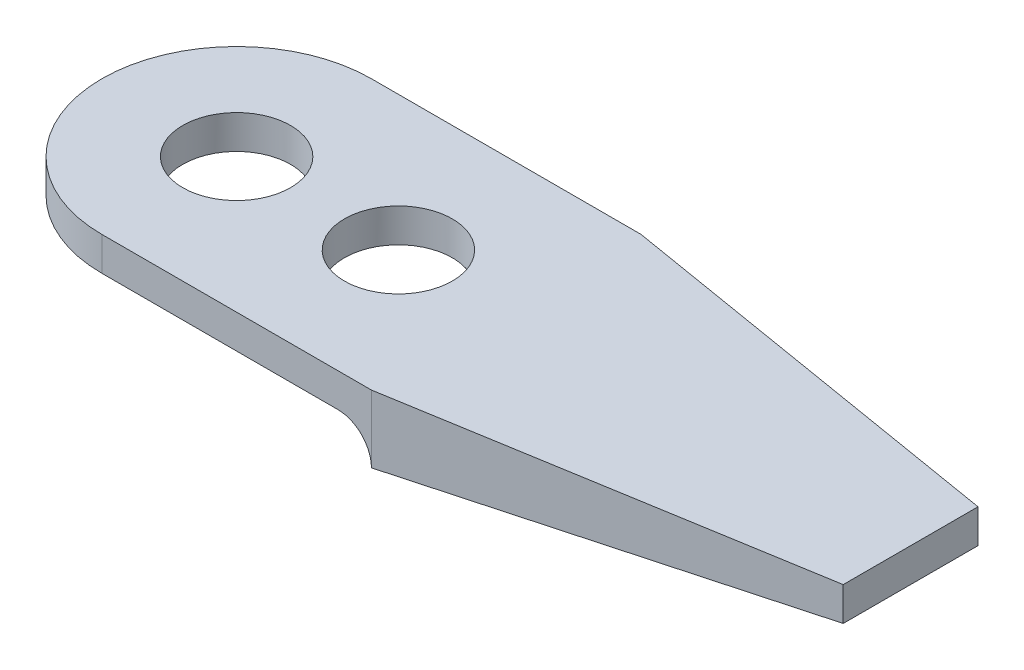
ISO-10303-21;
HEADER;
FILE_DESCRIPTION(('STEP AP214'),'2;1');
FILE_NAME('part.step','',(''),(''),'','','');
FILE_SCHEMA(('AUTOMOTIVE_DESIGN { 1 0 10303 214 1 1 1 1 }'));
ENDSEC;
DATA;
#1=APPLICATION_CONTEXT('core data for automotive mechanical design processes');
#2=APPLICATION_PROTOCOL_DEFINITION('international standard','automotive_design',2000,#1);
#3=PRODUCT_CONTEXT('',#1,'mechanical');
#4=PRODUCT('Part','Part','',(#3));
#5=PRODUCT_RELATED_PRODUCT_CATEGORY('part','',(#4));
#6=PRODUCT_DEFINITION_FORMATION('','',#4);
#7=PRODUCT_DEFINITION_CONTEXT('part definition',#1,'design');
#8=PRODUCT_DEFINITION('design','',#6,#7);
#9=PRODUCT_DEFINITION_SHAPE('','',#8);
#10=(LENGTH_UNIT() NAMED_UNIT(*) SI_UNIT(.MILLI.,.METRE.));
#11=(NAMED_UNIT(*) PLANE_ANGLE_UNIT() SI_UNIT($,.RADIAN.));
#12=(NAMED_UNIT(*) SI_UNIT($,.STERADIAN.) SOLID_ANGLE_UNIT());
#13=UNCERTAINTY_MEASURE_WITH_UNIT(LENGTH_MEASURE(1.E-05),#10,'distance_accuracy_value','');
#14=(GEOMETRIC_REPRESENTATION_CONTEXT(3) GLOBAL_UNCERTAINTY_ASSIGNED_CONTEXT((#13)) GLOBAL_UNIT_ASSIGNED_CONTEXT((#10,
#11,#12)) REPRESENTATION_CONTEXT('',''));
#15=CARTESIAN_POINT('',(0.,0.,0.));
#16=DIRECTION('',(0.,0.,1.));
#17=DIRECTION('',(1.,0.,0.));
#18=AXIS2_PLACEMENT_3D('',#15,#16,#17);
#19=CARTESIAN_POINT('',(19.05,-1.5875,6.35));
#20=DIRECTION('',(-0.0830454798537399,0.99654575824488,0.));
#21=DIRECTION('',(-0.99654575824488,-0.0830454798537399,0.));
#22=AXIS2_PLACEMENT_3D('',#19,#20,#21);
#23=PLANE('',#22);
#24=DIRECTION('',(0.983078304622849,0.081923192051904,-0.163846384103808));
#25=VECTOR('',#24,1.);
#26=CARTESIAN_POINT('',(18.5385906040268,-1.63011744966443,3.26023489932886));
#27=LINE('',#26,#25);
#28=CARTESIAN_POINT('',(0.,-3.175,6.35));
#29=VERTEX_POINT('',#28);
#30=CARTESIAN_POINT('',(19.05,-1.5875,3.175));
#31=VERTEX_POINT('',#30);
#32=EDGE_CURVE('E172',#29,#31,#27,.T.);
#33=ORIENTED_EDGE('',*,*,#32,.F.);
#34=DIRECTION('',(0.,0.,-1.));
#35=VECTOR('',#34,1.);
#36=CARTESIAN_POINT('',(0.,-3.175,6.35));
#37=LINE('',#36,#35);
#38=CARTESIAN_POINT('',(0.,-3.175,-6.35));
#39=VERTEX_POINT('',#38);
#40=EDGE_CURVE('E199',#29,#39,#37,.T.);
#41=ORIENTED_EDGE('',*,*,#40,.T.);
#42=DIRECTION('',(0.983078304622849,0.081923192051904,0.163846384103808));
#43=VECTOR('',#42,1.);
#44=CARTESIAN_POINT('',(20.5842281879195,-1.45964765100671,-2.91929530201342));
#45=LINE('',#44,#43);
#46=CARTESIAN_POINT('',(19.05,-1.5875,-3.175));
#47=VERTEX_POINT('',#46);
#48=EDGE_CURVE('E182',#39,#47,#45,.T.);
#49=ORIENTED_EDGE('',*,*,#48,.T.);
#50=DIRECTION('',(0.,0.,-1.));
#51=VECTOR('',#50,1.);
#52=CARTESIAN_POINT('',(19.05,-1.5875,6.35));
#53=LINE('',#52,#51);
#54=EDGE_CURVE('E196',#31,#47,#53,.T.);
#55=ORIENTED_EDGE('',*,*,#54,.F.);
#56=EDGE_LOOP('',(#33,#41,#49,#55));
#57=FACE_BOUND('',#56,.T.);
#58=ADVANCED_FACE('F39',(#57),#23,.F.);
#59=CARTESIAN_POINT('',(19.05,0.,6.35));
#60=DIRECTION('',(-1.,0.,0.));
#61=DIRECTION('',(0.,-1.,0.));
#62=AXIS2_PLACEMENT_3D('',#59,#60,#61);
#63=PLANE('',#62);
#64=DIRECTION('',(0.,1.,0.));
#65=VECTOR('',#64,1.);
#66=CARTESIAN_POINT('',(19.05,-12.7,3.175));
#67=LINE('',#66,#65);
#68=CARTESIAN_POINT('',(19.05,0.,3.175));
#69=VERTEX_POINT('',#68);
#70=EDGE_CURVE('E168',#31,#69,#67,.T.);
#71=ORIENTED_EDGE('',*,*,#70,.F.);
#72=ORIENTED_EDGE('',*,*,#54,.T.);
#73=DIRECTION('',(0.,1.,0.));
#74=VECTOR('',#73,1.);
#75=CARTESIAN_POINT('',(19.05,-12.7,-3.175));
#76=LINE('',#75,#74);
#77=CARTESIAN_POINT('',(19.05,0.,-3.175));
#78=VERTEX_POINT('',#77);
#79=EDGE_CURVE('E178',#47,#78,#76,.T.);
#80=ORIENTED_EDGE('',*,*,#79,.T.);
#81=DIRECTION('',(0.,0.,-1.));
#82=VECTOR('',#81,1.);
#83=CARTESIAN_POINT('',(19.05,0.,6.35));
#84=LINE('',#83,#82);
#85=EDGE_CURVE('E91',#69,#78,#84,.T.);
#86=ORIENTED_EDGE('',*,*,#85,.F.);
#87=EDGE_LOOP('',(#71,#72,#80,#86));
#88=FACE_BOUND('',#87,.T.);
#89=ADVANCED_FACE('F225',(#88),#63,.F.);
#90=CARTESIAN_POINT('',(-19.05,0.,6.35));
#91=DIRECTION('',(0.,-1.,0.));
#92=DIRECTION('',(0.,0.,-1.));
#93=AXIS2_PLACEMENT_3D('',#90,#91,#92);
#94=PLANE('',#93);
#95=CARTESIAN_POINT('',(-12.7,0.,0.));
#96=DIRECTION('',(0.,1.,0.));
#97=DIRECTION('',(0.,0.,1.));
#98=AXIS2_PLACEMENT_3D('',#95,#96,#97);
#99=CIRCLE('',#98,2.54);
#100=CARTESIAN_POINT('',(-12.7,0.,2.54));
#101=VERTEX_POINT('',#100);
#102=EDGE_CURVE('E151',#101,#101,#99,.T.);
#103=ORIENTED_EDGE('',*,*,#102,.F.);
#104=EDGE_LOOP('',(#103));
#105=FACE_BOUND('',#104,.T.);
#106=CARTESIAN_POINT('',(-5.08,0.,0.));
#107=DIRECTION('',(0.,1.,0.));
#108=DIRECTION('',(0.,0.,1.));
#109=AXIS2_PLACEMENT_3D('',#106,#107,#108);
#110=CIRCLE('',#109,2.54);
#111=CARTESIAN_POINT('',(-5.08,0.,2.54));
#112=VERTEX_POINT('',#111);
#113=EDGE_CURVE('E158',#112,#112,#110,.T.);
#114=ORIENTED_EDGE('',*,*,#113,.F.);
#115=EDGE_LOOP('',(#114));
#116=FACE_BOUND('',#115,.T.);
#117=DIRECTION('',(-1.,0.,0.));
#118=VECTOR('',#117,1.);
#119=CARTESIAN_POINT('',(-19.05,0.,-6.35));
#120=LINE('',#119,#118);
#121=CARTESIAN_POINT('',(0.,0.,-6.35));
#122=VERTEX_POINT('',#121);
#123=CARTESIAN_POINT('',(-12.7,0.,-6.35));
#124=VERTEX_POINT('',#123);
#125=EDGE_CURVE('E188',#122,#124,#120,.T.);
#126=ORIENTED_EDGE('',*,*,#125,.T.);
#127=CARTESIAN_POINT('',(-12.7,0.,0.));
#128=DIRECTION('',(0.,-1.,0.));
#129=DIRECTION('',(0.,0.,-1.));
#130=AXIS2_PLACEMENT_3D('',#127,#128,#129);
#131=CIRCLE('',#130,6.35);
#132=CARTESIAN_POINT('',(-19.05,0.,0.));
#133=VERTEX_POINT('',#132);
#134=EDGE_CURVE('E119',#124,#133,#131,.F.);
#135=ORIENTED_EDGE('',*,*,#134,.T.);
#136=CARTESIAN_POINT('',(-12.7,0.,0.));
#137=DIRECTION('',(0.,-1.,0.));
#138=DIRECTION('',(0.,0.,-1.));
#139=AXIS2_PLACEMENT_3D('',#136,#137,#138);
#140=CIRCLE('',#139,6.35);
#141=CARTESIAN_POINT('',(-12.7,0.,6.35));
#142=VERTEX_POINT('',#141);
#143=EDGE_CURVE('E113',#133,#142,#140,.F.);
#144=ORIENTED_EDGE('',*,*,#143,.T.);
#145=DIRECTION('',(-1.,0.,0.));
#146=VECTOR('',#145,1.);
#147=CARTESIAN_POINT('',(-19.05,0.,6.35));
#148=LINE('',#147,#146);
#149=CARTESIAN_POINT('',(0.,0.,6.35));
#150=VERTEX_POINT('',#149);
#151=EDGE_CURVE('E118',#150,#142,#148,.T.);
#152=ORIENTED_EDGE('',*,*,#151,.F.);
#153=DIRECTION('',(0.986393923832144,0.,-0.164398987305357));
#154=VECTOR('',#153,1.);
#155=CARTESIAN_POINT('',(0.,0.,6.35));
#156=LINE('',#155,#154);
#157=EDGE_CURVE('E145',#150,#69,#156,.T.);
#158=ORIENTED_EDGE('',*,*,#157,.T.);
#159=ORIENTED_EDGE('',*,*,#85,.T.);
#160=DIRECTION('',(0.986393923832144,0.,0.164398987305357));
#161=VECTOR('',#160,1.);
#162=CARTESIAN_POINT('',(0.,0.,-6.35));
#163=LINE('',#162,#161);
#164=EDGE_CURVE('E175',#122,#78,#163,.T.);
#165=ORIENTED_EDGE('',*,*,#164,.F.);
#166=EDGE_LOOP('',(#126,#135,#144,#152,#158,#159,#165));
#167=FACE_BOUND('',#166,.T.);
#168=ADVANCED_FACE('F116',(#105,#116,#167),#94,.F.);
#169=CARTESIAN_POINT('',(0.,0.,6.35));
#170=DIRECTION('',(0.,0.,-1.));
#171=DIRECTION('',(-1.,0.,0.));
#172=AXIS2_PLACEMENT_3D('',#169,#170,#171);
#173=PLANE('',#172);
#174=ORIENTED_EDGE('',*,*,#151,.T.);
#175=DIRECTION('',(0.,-1.,0.));
#176=VECTOR('',#175,1.);
#177=CARTESIAN_POINT('',(-12.7,0.,6.35));
#178=LINE('',#177,#176);
#179=CARTESIAN_POINT('',(-12.7,-1.5875,6.35));
#180=VERTEX_POINT('',#179);
#181=EDGE_CURVE('E129',#142,#180,#178,.T.);
#182=ORIENTED_EDGE('',*,*,#181,.T.);
#183=DIRECTION('',(1.,0.,0.));
#184=VECTOR('',#183,1.);
#185=CARTESIAN_POINT('',(0.,-1.5875,6.35));
#186=LINE('',#185,#184);
#187=CARTESIAN_POINT('',(-1.5875,-1.5875,6.35));
#188=VERTEX_POINT('',#187);
#189=EDGE_CURVE('E131',#180,#188,#186,.T.);
#190=ORIENTED_EDGE('',*,*,#189,.T.);
#191=CARTESIAN_POINT('',(-1.5875,-3.175,6.35));
#192=DIRECTION('',(0.,0.,-1.));
#193=DIRECTION('',(-1.,0.,0.));
#194=AXIS2_PLACEMENT_3D('',#191,#192,#193);
#195=CIRCLE('',#194,1.5875);
#196=EDGE_CURVE('E11',#188,#29,#195,.T.);
#197=ORIENTED_EDGE('',*,*,#196,.T.);
#198=DIRECTION('',(0.,-1.,0.));
#199=VECTOR('',#198,1.);
#200=CARTESIAN_POINT('',(0.,0.,6.35));
#201=LINE('',#200,#199);
#202=EDGE_CURVE('E57',#150,#29,#201,.T.);
#203=ORIENTED_EDGE('',*,*,#202,.F.);
#204=EDGE_LOOP('',(#174,#182,#190,#197,#203));
#205=FACE_BOUND('',#204,.T.);
#206=ADVANCED_FACE('F128',(#205),#173,.F.);
#207=CARTESIAN_POINT('',(0.,-1.5875,6.35));
#208=DIRECTION('',(0.,1.,0.));
#209=DIRECTION('',(-1.,0.,0.));
#210=AXIS2_PLACEMENT_3D('',#207,#208,#209);
#211=PLANE('',#210);
#212=CARTESIAN_POINT('',(-12.7,-1.5875,0.));
#213=DIRECTION('',(0.,1.,0.));
#214=DIRECTION('',(-1.,0.,0.));
#215=AXIS2_PLACEMENT_3D('',#212,#213,#214);
#216=CIRCLE('',#215,2.54);
#217=CARTESIAN_POINT('',(-15.24,-1.5875,0.));
#218=VERTEX_POINT('',#217);
#219=EDGE_CURVE('E43',#218,#218,#216,.T.);
#220=ORIENTED_EDGE('',*,*,#219,.T.);
#221=EDGE_LOOP('',(#220));
#222=FACE_BOUND('',#221,.T.);
#223=CARTESIAN_POINT('',(-5.08,-1.5875,0.));
#224=DIRECTION('',(0.,1.,0.));
#225=DIRECTION('',(-1.,0.,0.));
#226=AXIS2_PLACEMENT_3D('',#223,#224,#225);
#227=CIRCLE('',#226,2.54);
#228=CARTESIAN_POINT('',(-7.62,-1.5875,0.));
#229=VERTEX_POINT('',#228);
#230=EDGE_CURVE('E148',#229,#229,#227,.T.);
#231=ORIENTED_EDGE('',*,*,#230,.T.);
#232=EDGE_LOOP('',(#231));
#233=FACE_BOUND('',#232,.T.);
#234=DIRECTION('',(1.,0.,0.));
#235=VECTOR('',#234,1.);
#236=CARTESIAN_POINT('',(0.,-1.5875,-6.35));
#237=LINE('',#236,#235);
#238=CARTESIAN_POINT('',(-12.7,-1.5875,-6.35));
#239=VERTEX_POINT('',#238);
#240=CARTESIAN_POINT('',(-1.5875,-1.5875,-6.35));
#241=VERTEX_POINT('',#240);
#242=EDGE_CURVE('E186',#239,#241,#237,.T.);
#243=ORIENTED_EDGE('',*,*,#242,.T.);
#244=DIRECTION('',(0.,0.,-1.));
#245=VECTOR('',#244,1.);
#246=CARTESIAN_POINT('',(-1.5875,-1.5875,6.35));
#247=LINE('',#246,#245);
#248=EDGE_CURVE('E66',#241,#188,#247,.F.);
#249=ORIENTED_EDGE('',*,*,#248,.T.);
#250=ORIENTED_EDGE('',*,*,#189,.F.);
#251=CARTESIAN_POINT('',(-12.7,-1.5875,0.));
#252=DIRECTION('',(0.,1.,0.));
#253=DIRECTION('',(-1.,0.,0.));
#254=AXIS2_PLACEMENT_3D('',#251,#252,#253);
#255=CIRCLE('',#254,6.35);
#256=CARTESIAN_POINT('',(-19.05,-1.5875,0.));
#257=VERTEX_POINT('',#256);
#258=EDGE_CURVE('E135',#180,#257,#255,.F.);
#259=ORIENTED_EDGE('',*,*,#258,.T.);
#260=CARTESIAN_POINT('',(-12.7,-1.5875,0.));
#261=DIRECTION('',(0.,1.,0.));
#262=DIRECTION('',(-1.,0.,0.));
#263=AXIS2_PLACEMENT_3D('',#260,#261,#262);
#264=CIRCLE('',#263,6.35);
#265=EDGE_CURVE('E209',#257,#239,#264,.F.);
#266=ORIENTED_EDGE('',*,*,#265,.T.);
#267=EDGE_LOOP('',(#243,#249,#250,#259,#266));
#268=FACE_BOUND('',#267,.T.);
#269=ADVANCED_FACE('F249',(#222,#233,#268),#211,.F.);
#270=CARTESIAN_POINT('',(0.,0.,-6.35));
#271=DIRECTION('',(0.,0.,-1.));
#272=DIRECTION('',(-1.,0.,0.));
#273=AXIS2_PLACEMENT_3D('',#270,#271,#272);
#274=PLANE('',#273);
#275=ORIENTED_EDGE('',*,*,#242,.F.);
#276=DIRECTION('',(0.,-1.,0.));
#277=VECTOR('',#276,1.);
#278=CARTESIAN_POINT('',(-12.7,0.,-6.35));
#279=LINE('',#278,#277);
#280=EDGE_CURVE('E125',#239,#124,#279,.F.);
#281=ORIENTED_EDGE('',*,*,#280,.T.);
#282=ORIENTED_EDGE('',*,*,#125,.F.);
#283=DIRECTION('',(0.,1.,0.));
#284=VECTOR('',#283,1.);
#285=CARTESIAN_POINT('',(0.,0.,-6.35));
#286=LINE('',#285,#284);
#287=EDGE_CURVE('E79',#39,#122,#286,.T.);
#288=ORIENTED_EDGE('',*,*,#287,.F.);
#289=CARTESIAN_POINT('',(-1.5875,-3.175,-6.35));
#290=DIRECTION('',(0.,0.,-1.));
#291=DIRECTION('',(-1.,0.,0.));
#292=AXIS2_PLACEMENT_3D('',#289,#290,#291);
#293=CIRCLE('',#292,1.5875);
#294=EDGE_CURVE('E49',#39,#241,#293,.F.);
#295=ORIENTED_EDGE('',*,*,#294,.T.);
#296=EDGE_LOOP('',(#275,#281,#282,#288,#295));
#297=FACE_BOUND('',#296,.T.);
#298=ADVANCED_FACE('F216',(#297),#274,.T.);
#299=CARTESIAN_POINT('',(0.,-12.7,-6.35));
#300=DIRECTION('',(-0.164398987305357,0.,0.986393923832144));
#301=DIRECTION('',(0.986393923832144,0.,0.164398987305357));
#302=AXIS2_PLACEMENT_3D('',#299,#300,#301);
#303=PLANE('',#302);
#304=ORIENTED_EDGE('',*,*,#48,.F.);
#305=ORIENTED_EDGE('',*,*,#287,.T.);
#306=ORIENTED_EDGE('',*,*,#164,.T.);
#307=ORIENTED_EDGE('',*,*,#79,.F.);
#308=EDGE_LOOP('',(#304,#305,#306,#307));
#309=FACE_BOUND('',#308,.T.);
#310=ADVANCED_FACE('F222',(#309),#303,.F.);
#311=CARTESIAN_POINT('',(0.,-12.7,6.35));
#312=DIRECTION('',(0.164398987305357,0.,0.986393923832144));
#313=DIRECTION('',(0.986393923832144,0.,-0.164398987305357));
#314=AXIS2_PLACEMENT_3D('',#311,#312,#313);
#315=PLANE('',#314);
#316=ORIENTED_EDGE('',*,*,#32,.T.);
#317=ORIENTED_EDGE('',*,*,#70,.T.);
#318=ORIENTED_EDGE('',*,*,#157,.F.);
#319=ORIENTED_EDGE('',*,*,#202,.T.);
#320=EDGE_LOOP('',(#316,#317,#318,#319));
#321=FACE_BOUND('',#320,.T.);
#322=ADVANCED_FACE('F231',(#321),#315,.T.);
#323=CARTESIAN_POINT('',(-12.7,0.,0.));
#324=DIRECTION('',(0.,-1.,0.));
#325=DIRECTION('',(1.,0.,0.));
#326=AXIS2_PLACEMENT_3D('',#323,#324,#325);
#327=CYLINDRICAL_SURFACE('',#326,6.35);
#328=ORIENTED_EDGE('',*,*,#181,.F.);
#329=ORIENTED_EDGE('',*,*,#143,.F.);
#330=DIRECTION('',(0.,-1.,0.));
#331=VECTOR('',#330,1.);
#332=CARTESIAN_POINT('',(-19.05,-1.5875,0.));
#333=LINE('',#332,#331);
#334=EDGE_CURVE('E143',#257,#133,#333,.F.);
#335=ORIENTED_EDGE('',*,*,#334,.F.);
#336=ORIENTED_EDGE('',*,*,#258,.F.);
#337=EDGE_LOOP('',(#328,#329,#335,#336));
#338=FACE_BOUND('',#337,.T.);
#339=ADVANCED_FACE('F134',(#338),#327,.T.);
#340=CARTESIAN_POINT('',(-12.7,-1.58750000000001,0.));
#341=DIRECTION('',(0.,1.,0.));
#342=DIRECTION('',(-1.,0.,0.));
#343=AXIS2_PLACEMENT_3D('',#340,#341,#342);
#344=CYLINDRICAL_SURFACE('',#343,6.35);
#345=ORIENTED_EDGE('',*,*,#134,.F.);
#346=ORIENTED_EDGE('',*,*,#280,.F.);
#347=ORIENTED_EDGE('',*,*,#265,.F.);
#348=ORIENTED_EDGE('',*,*,#334,.T.);
#349=EDGE_LOOP('',(#345,#346,#347,#348));
#350=FACE_BOUND('',#349,.T.);
#351=ADVANCED_FACE('F238',(#350),#344,.T.);
#352=CARTESIAN_POINT('',(-1.5875,-3.175,6.35));
#353=DIRECTION('',(0.,0.,1.));
#354=DIRECTION('',(1.,0.,0.));
#355=AXIS2_PLACEMENT_3D('',#352,#353,#354);
#356=CYLINDRICAL_SURFACE('',#355,1.5875);
#357=ORIENTED_EDGE('',*,*,#196,.F.);
#358=ORIENTED_EDGE('',*,*,#248,.F.);
#359=ORIENTED_EDGE('',*,*,#294,.F.);
#360=ORIENTED_EDGE('',*,*,#40,.F.);
#361=EDGE_LOOP('',(#357,#358,#359,#360));
#362=FACE_BOUND('',#361,.T.);
#363=ADVANCED_FACE('F41',(#362),#356,.F.);
#364=CARTESIAN_POINT('',(-5.08,-12.7,0.));
#365=DIRECTION('',(0.,1.,0.));
#366=DIRECTION('',(0.,0.,1.));
#367=AXIS2_PLACEMENT_3D('',#364,#365,#366);
#368=CYLINDRICAL_SURFACE('',#367,2.54);
#369=ORIENTED_EDGE('',*,*,#113,.T.);
#370=EDGE_LOOP('',(#369));
#371=FACE_BOUND('',#370,.T.);
#372=ORIENTED_EDGE('',*,*,#230,.F.);
#373=EDGE_LOOP('',(#372));
#374=FACE_BOUND('',#373,.T.);
#375=ADVANCED_FACE('F257',(#371,#374),#368,.F.);
#376=CARTESIAN_POINT('',(-12.7,-12.7,0.));
#377=DIRECTION('',(0.,1.,0.));
#378=DIRECTION('',(0.,0.,1.));
#379=AXIS2_PLACEMENT_3D('',#376,#377,#378);
#380=CYLINDRICAL_SURFACE('',#379,2.54);
#381=ORIENTED_EDGE('',*,*,#102,.T.);
#382=EDGE_LOOP('',(#381));
#383=FACE_BOUND('',#382,.T.);
#384=ORIENTED_EDGE('',*,*,#219,.F.);
#385=EDGE_LOOP('',(#384));
#386=FACE_BOUND('',#385,.T.);
#387=ADVANCED_FACE('F264',(#383,#386),#380,.F.);
#388=CLOSED_SHELL('',(#58,#89,#168,#206,#269,#298,#310,#322,#339,#351,#363,#375,#387));
#389=MANIFOLD_SOLID_BREP('B2',#388);
#390=ADVANCED_BREP_SHAPE_REPRESENTATION('',(#18,#389),#14);
#391=SHAPE_DEFINITION_REPRESENTATION(#9,#390);
ENDSEC;
END-ISO-10303-21;
